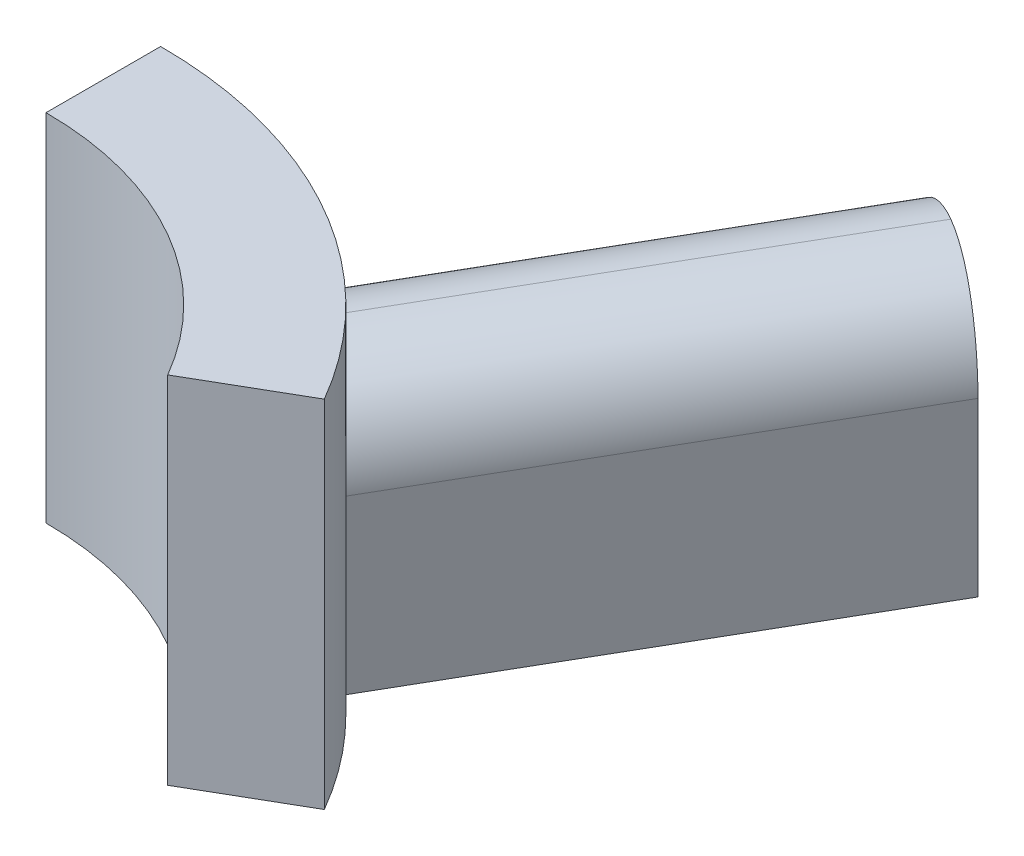
ISO-10303-21;
HEADER;
FILE_DESCRIPTION(('STEP AP214'),'2;1');
FILE_NAME('part.step','',(''),(''),'','','');
FILE_SCHEMA(('AUTOMOTIVE_DESIGN { 1 0 10303 214 1 1 1 1 }'));
ENDSEC;
DATA;
#1=APPLICATION_CONTEXT('core data for automotive mechanical design processes');
#2=APPLICATION_PROTOCOL_DEFINITION('international standard','automotive_design',2000,#1);
#3=PRODUCT_CONTEXT('',#1,'mechanical');
#4=PRODUCT('Part','Part','',(#3));
#5=PRODUCT_RELATED_PRODUCT_CATEGORY('part','',(#4));
#6=PRODUCT_DEFINITION_FORMATION('','',#4);
#7=PRODUCT_DEFINITION_CONTEXT('part definition',#1,'design');
#8=PRODUCT_DEFINITION('design','',#6,#7);
#9=PRODUCT_DEFINITION_SHAPE('','',#8);
#10=(LENGTH_UNIT() NAMED_UNIT(*) SI_UNIT(.MILLI.,.METRE.));
#11=(NAMED_UNIT(*) PLANE_ANGLE_UNIT() SI_UNIT($,.RADIAN.));
#12=(NAMED_UNIT(*) SI_UNIT($,.STERADIAN.) SOLID_ANGLE_UNIT());
#13=UNCERTAINTY_MEASURE_WITH_UNIT(LENGTH_MEASURE(1.E-05),#10,'distance_accuracy_value','');
#14=(GEOMETRIC_REPRESENTATION_CONTEXT(3) GLOBAL_UNCERTAINTY_ASSIGNED_CONTEXT((#13)) GLOBAL_UNIT_ASSIGNED_CONTEXT((#10,
#11,#12)) REPRESENTATION_CONTEXT('',''));
#15=CARTESIAN_POINT('',(0.,0.,0.));
#16=DIRECTION('',(0.,0.,1.));
#17=DIRECTION('',(1.,0.,0.));
#18=AXIS2_PLACEMENT_3D('',#15,#16,#17);
#19=CARTESIAN_POINT('',(0.,15.5,0.));
#20=DIRECTION('',(0.,-1.,0.));
#21=DIRECTION('',(0.,0.,-1.));
#22=AXIS2_PLACEMENT_3D('',#19,#20,#21);
#23=CYLINDRICAL_SURFACE('',#22,14.5);
#24=CARTESIAN_POINT('',(0.,0.,0.));
#25=DIRECTION('',(0.,-1.,0.));
#26=DIRECTION('',(0.,0.,1.));
#27=AXIS2_PLACEMENT_3D('',#24,#25,#26);
#28=CIRCLE('',#27,14.5);
#29=CARTESIAN_POINT('',(0.,0.,-14.5));
#30=VERTEX_POINT('',#29);
#31=CARTESIAN_POINT('',(12.5573683548744,0.,-7.24999999999997));
#32=VERTEX_POINT('',#31);
#33=EDGE_CURVE('E139',#30,#32,#28,.T.);
#34=ORIENTED_EDGE('',*,*,#33,.T.);
#35=DIRECTION('',(0.,-1.,0.));
#36=VECTOR('',#35,1.);
#37=CARTESIAN_POINT('',(12.5573683548744,15.5,-7.24999999999997));
#38=LINE('',#37,#36);
#39=CARTESIAN_POINT('',(12.5573683548744,15.5,-7.24999999999997));
#40=VERTEX_POINT('',#39);
#41=EDGE_CURVE('E164',#40,#32,#38,.T.);
#42=ORIENTED_EDGE('',*,*,#41,.F.);
#43=CARTESIAN_POINT('',(0.,15.5,0.));
#44=DIRECTION('',(0.,-1.,0.));
#45=DIRECTION('',(0.,0.,1.));
#46=AXIS2_PLACEMENT_3D('',#43,#44,#45);
#47=CIRCLE('',#46,14.5);
#48=CARTESIAN_POINT('',(0.,15.5,-14.5));
#49=VERTEX_POINT('',#48);
#50=EDGE_CURVE('E143',#49,#40,#47,.T.);
#51=ORIENTED_EDGE('',*,*,#50,.F.);
#52=DIRECTION('',(0.,-1.,0.));
#53=VECTOR('',#52,1.);
#54=CARTESIAN_POINT('',(0.,15.5,-14.5));
#55=LINE('',#54,#53);
#56=EDGE_CURVE('E152',#49,#30,#55,.T.);
#57=ORIENTED_EDGE('',*,*,#56,.T.);
#58=EDGE_LOOP('',(#34,#42,#51,#57));
#59=FACE_BOUND('',#58,.T.);
#60=ADVANCED_FACE('F38',(#59),#23,.F.);
#61=CARTESIAN_POINT('',(12.5573683548744,15.5,-7.24999999999997));
#62=DIRECTION('',(-0.499999999999998,0.,-0.86602540378444));
#63=DIRECTION('',(-0.86602540378444,0.,0.499999999999998));
#64=AXIS2_PLACEMENT_3D('',#61,#62,#63);
#65=PLANE('',#64);
#66=DIRECTION('',(0.86602540378444,0.,-0.499999999999998));
#67=VECTOR('',#66,1.);
#68=CARTESIAN_POINT('',(12.5573683548744,0.,-7.24999999999997));
#69=LINE('',#68,#67);
#70=CARTESIAN_POINT('',(16.8874953737966,0.,-9.74999999999996));
#71=VERTEX_POINT('',#70);
#72=EDGE_CURVE('E125',#32,#71,#69,.T.);
#73=ORIENTED_EDGE('',*,*,#72,.T.);
#74=DIRECTION('',(0.,-1.,0.));
#75=VECTOR('',#74,1.);
#76=CARTESIAN_POINT('',(16.8874953737966,15.5,-9.74999999999996));
#77=LINE('',#76,#75);
#78=CARTESIAN_POINT('',(16.8874953737966,15.5,-9.74999999999996));
#79=VERTEX_POINT('',#78);
#80=EDGE_CURVE('E161',#79,#71,#77,.T.);
#81=ORIENTED_EDGE('',*,*,#80,.F.);
#82=DIRECTION('',(0.86602540378444,0.,-0.499999999999998));
#83=VECTOR('',#82,1.);
#84=CARTESIAN_POINT('',(12.5573683548744,15.5,-7.24999999999997));
#85=LINE('',#84,#83);
#86=EDGE_CURVE('E146',#40,#79,#85,.T.);
#87=ORIENTED_EDGE('',*,*,#86,.F.);
#88=ORIENTED_EDGE('',*,*,#41,.T.);
#89=EDGE_LOOP('',(#73,#81,#87,#88));
#90=FACE_BOUND('',#89,.T.);
#91=ADVANCED_FACE('F206',(#90),#65,.F.);
#92=CARTESIAN_POINT('',(0.,15.5,0.));
#93=DIRECTION('',(0.,-1.,0.));
#94=DIRECTION('',(0.,0.,-1.));
#95=AXIS2_PLACEMENT_3D('',#92,#93,#94);
#96=CYLINDRICAL_SURFACE('',#95,19.5);
#97=CARTESIAN_POINT('',(0.,0.,0.));
#98=DIRECTION('',(0.,1.,0.));
#99=DIRECTION('',(0.,0.,-1.));
#100=AXIS2_PLACEMENT_3D('',#97,#98,#99);
#101=CIRCLE('',#100,19.5);
#102=CARTESIAN_POINT('',(13.0067689571336,0.,-14.5283846760659));
#103=VERTEX_POINT('',#102);
#104=EDGE_CURVE('E124',#71,#103,#101,.T.);
#105=ORIENTED_EDGE('',*,*,#104,.T.);
#106=DIRECTION('',(0.,-1.,0.));
#107=VECTOR('',#106,1.);
#108=CARTESIAN_POINT('',(13.0067689571336,11.5,-14.5283846760659));
#109=LINE('',#108,#107);
#110=CARTESIAN_POINT('',(13.0067689571336,7.5,-14.5283846760659));
#111=VERTEX_POINT('',#110);
#112=EDGE_CURVE('E137',#111,#103,#109,.T.);
#113=ORIENTED_EDGE('',*,*,#112,.F.);
#114=CARTESIAN_POINT('',(13.0067689571336,7.5,-14.5283846760659));
#115=CARTESIAN_POINT('',(13.0067745263207,7.61124302147211,-14.5283700124707));
#116=CARTESIAN_POINT('',(13.0032363735848,7.72247928579882,-14.5315470320631));
#117=CARTESIAN_POINT('',(12.9891175678691,7.94413215695619,-14.5441737088385));
#118=CARTESIAN_POINT('',(12.9785378153802,8.0545488667674,-14.5536225639688));
#119=CARTESIAN_POINT('',(12.9504035782809,8.27360745579319,-14.5786619030037));
#120=CARTESIAN_POINT('',(12.9328604396675,8.38225192432975,-14.5942423957949));
#121=CARTESIAN_POINT('',(12.8909030600824,8.59714871967826,-14.6313155751818));
#122=CARTESIAN_POINT('',(12.8664887854479,8.70340103476793,-14.6528082907424));
#123=CARTESIAN_POINT('',(12.7830845929439,9.01747765679169,-14.7257694425751));
#124=CARTESIAN_POINT('',(12.7139109852058,9.22079557702581,-14.7857412602684));
#125=CARTESIAN_POINT('',(12.5498038869681,9.60939022750871,-14.9252787631987));
#126=CARTESIAN_POINT('',(12.4548666373388,9.79466431964814,-15.0048473076042));
#127=CARTESIAN_POINT('',(12.2395215627638,10.1447481899075,-15.181030078342));
#128=CARTESIAN_POINT('',(12.1187943608289,10.3092558800996,-15.2778552531358));
#129=CARTESIAN_POINT('',(11.8549045992679,10.6104774308643,-15.4835126972947));
#130=CARTESIAN_POINT('',(11.7117378108328,10.7471860414361,-15.5923472287132));
#131=CARTESIAN_POINT('',(11.404433726395,10.9901351957022,-15.8185205713314));
#132=CARTESIAN_POINT('',(11.2401112380226,11.0960759583554,-15.9359299603715));
#133=CARTESIAN_POINT('',(10.8953592362019,11.2725068851001,-16.1735849386173));
#134=CARTESIAN_POINT('',(10.7149412327732,11.3430221466939,-16.2938284565526));
#135=CARTESIAN_POINT('',(10.4031121306151,11.4296624591288,-16.4938661656015));
#136=CARTESIAN_POINT('',(10.2747580780029,11.4560069800233,-16.574145615023));
#137=CARTESIAN_POINT('',(10.0146004455167,11.4911820250999,-16.7326394329615));
#138=CARTESIAN_POINT('',(9.88280030637617,11.500029389919,-16.8108557156031));
#139=CARTESIAN_POINT('',(9.74999999999961,11.5,-16.8874953737968));
#140=B_SPLINE_CURVE_WITH_KNOTS('',3,(#114,#115,#116,#117,#118,#119,#120,#121,#122,#123,#124,
#125,#126,#127,#128,#129,#130,#131,#132,#133,#134,#135,#136,#137,#138,#139),.UNSPECIFIED.,.F.,
.F.,(4,2,2,2,2,2,2,2,2,2,2,2,4),(0.,0.333615682105476,0.66718870910794,1.00022043568754,
1.33325379386683,1.99879754485732,2.66443845647286,3.33885734324877,4.01340347949084,
4.69431692087422,5.37474728055635,5.8347610693584,6.29433188887586),.UNSPECIFIED.);
#141=CARTESIAN_POINT('',(9.74999999999961,11.5,-16.8874953737968));
#142=VERTEX_POINT('',#141);
#143=EDGE_CURVE('E48',#111,#142,#140,.T.);
#144=ORIENTED_EDGE('',*,*,#143,.T.);
#145=CARTESIAN_POINT('',(9.74999999999962,11.5,-16.8874953737968));
#146=CARTESIAN_POINT('',(9.65364368731658,11.5000120955402,-16.9431372533105));
#147=CARTESIAN_POINT('',(9.55680790616495,11.4953574287586,-16.9979354332376));
#148=CARTESIAN_POINT('',(9.36290835420122,11.4768083431247,-17.1055004149339));
#149=CARTESIAN_POINT('',(9.2658446126663,11.4629150523678,-17.1582674638852));
#150=CARTESIAN_POINT('',(9.0723499753815,11.4260117752553,-17.2613580312628));
#151=CARTESIAN_POINT('',(8.97591831941023,11.4030163021566,-17.3116852971764));
#152=CARTESIAN_POINT('',(8.78429463195907,11.348112701685,-17.409703441215));
#153=CARTESIAN_POINT('',(8.68910260479188,11.3162045433133,-17.4573943101698));
#154=CARTESIAN_POINT('',(8.40644911115283,11.2074269867779,-17.5961778724217));
#155=CARTESIAN_POINT('',(8.22176160288913,11.117475975776,-17.683060269573));
#156=CARTESIAN_POINT('',(7.8659508846285,10.9054483987288,-17.8441899330365));
#157=CARTESIAN_POINT('',(7.69482943037993,10.7833676831906,-17.9184355652925));
#158=CARTESIAN_POINT('',(7.36934959639729,10.5087020704534,-18.0547560548947));
#159=CARTESIAN_POINT('',(7.21522916356286,10.3557527684681,-18.116666063137));
#160=CARTESIAN_POINT('',(6.9313796119343,10.0244542560789,-18.2271567988212));
#161=CARTESIAN_POINT('',(6.80165544898798,9.84609989780674,-18.2757348189273));
#162=CARTESIAN_POINT('',(6.57003062945157,9.46692501166165,-18.3602858968628));
#163=CARTESIAN_POINT('',(6.4684169785501,9.26590027310167,-18.3961299228394));
#164=CARTESIAN_POINT('',(6.29868849146471,8.84848352907437,-18.4549354326921));
#165=CARTESIAN_POINT('',(6.23054940634088,8.63210277791515,-18.4779062436146));
#166=CARTESIAN_POINT('',(6.14673877314093,8.26208588967874,-18.505914807064));
#167=CARTESIAN_POINT('',(6.12121816105916,8.11085913219336,-18.5143524219897));
#168=CARTESIAN_POINT('',(6.0871190890969,7.8064464361338,-18.5255787608175));
#169=CARTESIAN_POINT('',(6.07852477010785,7.65326246697651,-18.5283727725627));
#170=CARTESIAN_POINT('',(6.07856572685798,7.5,-18.5283846760657));
#171=B_SPLINE_CURVE_WITH_KNOTS('',3,(#145,#146,#147,#148,#149,#150,#151,#152,#153,#154,#155,
#156,#157,#158,#159,#160,#161,#162,#163,#164,#165,#166,#167,#168,#169,#170),.UNSPECIFIED.,.F.,
.F.,(4,2,2,2,2,2,2,2,2,2,2,2,4),(0.,0.333690822761368,0.667340907206283,1.00046112221227,
1.33358249584287,1.99931986785164,2.66514326086116,3.33934228099366,4.01367811003857,
4.6946640930046,5.37515604036038,5.83495929024732,6.29433152164226),.UNSPECIFIED.);
#172=CARTESIAN_POINT('',(6.07856572685798,7.5,-18.5283846760657));
#173=VERTEX_POINT('',#172);
#174=EDGE_CURVE('E11',#142,#173,#171,.T.);
#175=ORIENTED_EDGE('',*,*,#174,.T.);
#176=DIRECTION('',(0.,-1.,0.));
#177=VECTOR('',#176,1.);
#178=CARTESIAN_POINT('',(6.07856572685798,11.5,-18.5283846760657));
#179=LINE('',#178,#177);
#180=CARTESIAN_POINT('',(6.07856572685798,0.,-18.5283846760657));
#181=VERTEX_POINT('',#180);
#182=EDGE_CURVE('E103',#173,#181,#179,.T.);
#183=ORIENTED_EDGE('',*,*,#182,.T.);
#184=CARTESIAN_POINT('',(0.,0.,-19.5));
#185=VERTEX_POINT('',#184);
#186=EDGE_CURVE('E108',#181,#185,#101,.T.);
#187=ORIENTED_EDGE('',*,*,#186,.T.);
#188=DIRECTION('',(0.,-1.,0.));
#189=VECTOR('',#188,1.);
#190=CARTESIAN_POINT('',(0.,15.5,-19.5));
#191=LINE('',#190,#189);
#192=CARTESIAN_POINT('',(0.,15.5,-19.5));
#193=VERTEX_POINT('',#192);
#194=EDGE_CURVE('E159',#193,#185,#191,.T.);
#195=ORIENTED_EDGE('',*,*,#194,.F.);
#196=CARTESIAN_POINT('',(0.,15.5,0.));
#197=DIRECTION('',(0.,1.,0.));
#198=DIRECTION('',(0.,0.,-1.));
#199=AXIS2_PLACEMENT_3D('',#196,#197,#198);
#200=CIRCLE('',#199,19.5);
#201=EDGE_CURVE('E148',#79,#193,#200,.T.);
#202=ORIENTED_EDGE('',*,*,#201,.F.);
#203=ORIENTED_EDGE('',*,*,#80,.T.);
#204=EDGE_LOOP('',(#105,#113,#144,#175,#183,#187,#195,#202,#203));
#205=FACE_BOUND('',#204,.T.);
#206=ADVANCED_FACE('F106',(#205),#96,.T.);
#207=CARTESIAN_POINT('',(0.,15.5,-14.5));
#208=DIRECTION('',(1.,0.,0.));
#209=DIRECTION('',(0.,0.,-1.));
#210=AXIS2_PLACEMENT_3D('',#207,#208,#209);
#211=PLANE('',#210);
#212=DIRECTION('',(0.,0.,1.));
#213=VECTOR('',#212,1.);
#214=CARTESIAN_POINT('',(0.,0.,-14.5));
#215=LINE('',#214,#213);
#216=EDGE_CURVE('E123',#185,#30,#215,.T.);
#217=ORIENTED_EDGE('',*,*,#216,.T.);
#218=ORIENTED_EDGE('',*,*,#56,.F.);
#219=DIRECTION('',(0.,0.,1.));
#220=VECTOR('',#219,1.);
#221=CARTESIAN_POINT('',(0.,15.5,-14.5));
#222=LINE('',#221,#220);
#223=EDGE_CURVE('E150',#193,#49,#222,.T.);
#224=ORIENTED_EDGE('',*,*,#223,.F.);
#225=ORIENTED_EDGE('',*,*,#194,.T.);
#226=EDGE_LOOP('',(#217,#218,#224,#225));
#227=FACE_BOUND('',#226,.T.);
#228=ADVANCED_FACE('F196',(#227),#211,.F.);
#229=CARTESIAN_POINT('',(0.,15.5,0.));
#230=DIRECTION('',(0.,1.,0.));
#231=DIRECTION('',(0.,0.,1.));
#232=AXIS2_PLACEMENT_3D('',#229,#230,#231);
#233=PLANE('',#232);
#234=ORIENTED_EDGE('',*,*,#50,.T.);
#235=ORIENTED_EDGE('',*,*,#86,.T.);
#236=ORIENTED_EDGE('',*,*,#201,.T.);
#237=ORIENTED_EDGE('',*,*,#223,.T.);
#238=EDGE_LOOP('',(#234,#235,#236,#237));
#239=FACE_BOUND('',#238,.T.);
#240=ADVANCED_FACE('F193',(#239),#233,.T.);
#241=CARTESIAN_POINT('',(0.,0.,0.));
#242=DIRECTION('',(0.,1.,0.));
#243=DIRECTION('',(0.,0.,1.));
#244=AXIS2_PLACEMENT_3D('',#241,#242,#243);
#245=PLANE('',#244);
#246=ORIENTED_EDGE('',*,*,#33,.F.);
#247=ORIENTED_EDGE('',*,*,#216,.F.);
#248=ORIENTED_EDGE('',*,*,#186,.F.);
#249=DIRECTION('',(0.499999999999995,0.,-0.866025403784442));
#250=VECTOR('',#249,1.);
#251=CARTESIAN_POINT('',(6.07856572685798,0.,-18.5283846760657));
#252=LINE('',#251,#250);
#253=CARTESIAN_POINT('',(16.1843716079902,0.,-36.0321539136153));
#254=VERTEX_POINT('',#253);
#255=EDGE_CURVE('E122',#181,#254,#252,.T.);
#256=ORIENTED_EDGE('',*,*,#255,.T.);
#257=CARTESIAN_POINT('',(1.85181731060524E-12,0.,1.11759559939806E-12));
#258=DIRECTION('',(0.,-1.,0.));
#259=DIRECTION('',(0.,0.,1.));
#260=AXIS2_PLACEMENT_3D('',#257,#258,#259);
#261=CIRCLE('',#260,39.5);
#262=CARTESIAN_POINT('',(23.1125748382659,0.,-32.0321539136158));
#263=VERTEX_POINT('',#262);
#264=EDGE_CURVE('E130',#254,#263,#261,.T.);
#265=ORIENTED_EDGE('',*,*,#264,.T.);
#266=DIRECTION('',(-0.499999999999995,0.,0.866025403784442));
#267=VECTOR('',#266,1.);
#268=CARTESIAN_POINT('',(13.0067689571336,0.,-14.5283846760659));
#269=LINE('',#268,#267);
#270=EDGE_CURVE('E114',#263,#103,#269,.T.);
#271=ORIENTED_EDGE('',*,*,#270,.T.);
#272=ORIENTED_EDGE('',*,*,#104,.F.);
#273=ORIENTED_EDGE('',*,*,#72,.F.);
#274=EDGE_LOOP('',(#246,#247,#248,#256,#265,#271,#272,#273));
#275=FACE_BOUND('',#274,.T.);
#276=ADVANCED_FACE('F120',(#275),#245,.F.);
#277=CARTESIAN_POINT('',(13.0067689571336,11.5,-14.5283846760659));
#278=DIRECTION('',(0.866025403784441,0.,0.499999999999995));
#279=DIRECTION('',(0.499999999999995,0.,-0.866025403784442));
#280=AXIS2_PLACEMENT_3D('',#277,#278,#279);
#281=PLANE('',#280);
#282=DIRECTION('',(0.,-1.,0.));
#283=VECTOR('',#282,1.);
#284=CARTESIAN_POINT('',(23.1125748382659,11.5,-32.0321539136158));
#285=LINE('',#284,#283);
#286=CARTESIAN_POINT('',(23.1125748382659,7.5,-32.0321539136158));
#287=VERTEX_POINT('',#286);
#288=EDGE_CURVE('E140',#287,#263,#285,.T.);
#289=ORIENTED_EDGE('',*,*,#288,.F.);
#290=DIRECTION('',(-0.499999999999995,0.,0.866025403784442));
#291=VECTOR('',#290,1.);
#292=CARTESIAN_POINT('',(13.0067689571336,7.5,-14.5283846760659));
#293=LINE('',#292,#291);
#294=EDGE_CURVE('E167',#287,#111,#293,.T.);
#295=ORIENTED_EDGE('',*,*,#294,.T.);
#296=ORIENTED_EDGE('',*,*,#112,.T.);
#297=ORIENTED_EDGE('',*,*,#270,.F.);
#298=EDGE_LOOP('',(#289,#295,#296,#297));
#299=FACE_BOUND('',#298,.T.);
#300=ADVANCED_FACE('F188',(#299),#281,.T.);
#301=CARTESIAN_POINT('',(1.85181731060524E-12,11.5,1.11759559939806E-12));
#302=DIRECTION('',(0.,-1.,0.));
#303=DIRECTION('',(0.,0.,-1.));
#304=AXIS2_PLACEMENT_3D('',#301,#302,#303);
#305=CYLINDRICAL_SURFACE('',#304,39.5);
#306=CARTESIAN_POINT('',(16.1843716079902,7.5,-36.0321539136153));
#307=CARTESIAN_POINT('',(16.1843596182553,7.61220002393492,-36.0321553794729));
#308=CARTESIAN_POINT('',(16.188700113566,7.72439454671037,-36.0302095999937));
#309=CARTESIAN_POINT('',(16.2059940740696,7.9479751767217,-36.0224363507957));
#310=CARTESIAN_POINT('',(16.2189469620056,8.05936133763329,-36.0166091412347));
#311=CARTESIAN_POINT('',(16.2533570704049,8.28043604555169,-36.001093341293));
#312=CARTESIAN_POINT('',(16.2748060477621,8.39012613126441,-35.9914084936329));
#313=CARTESIAN_POINT('',(16.3260045202391,8.60710649819558,-35.9682131723672));
#314=CARTESIAN_POINT('',(16.3557539476558,8.7143967989803,-35.9547027299653));
#315=CARTESIAN_POINT('',(16.4571503442326,9.03161658094059,-35.9084643334851));
#316=CARTESIAN_POINT('',(16.5409628005208,9.23700550991374,-35.8700216083821));
#317=CARTESIAN_POINT('',(16.738143619376,9.62932671701325,-35.7784331963734));
#318=CARTESIAN_POINT('',(16.851509128466,9.81626077463733,-35.7252889289359));
#319=CARTESIAN_POINT('',(17.1045951941344,10.1672047083445,-35.6048097609999));
#320=CARTESIAN_POINT('',(17.2443986475194,10.331139574894,-35.5374301451676));
#321=CARTESIAN_POINT('',(17.5457407981071,10.6307723478115,-35.3896182731842));
#322=CARTESIAN_POINT('',(17.7072836812781,10.7664648032034,-35.3091835026223));
#323=CARTESIAN_POINT('',(18.0474799819594,11.0060336470533,-35.1365181080989));
#324=CARTESIAN_POINT('',(18.2261731052268,11.1098337477953,-35.0442599370461));
#325=CARTESIAN_POINT('',(18.5948642613463,11.2821457843439,-34.8500260063814));
#326=CARTESIAN_POINT('',(18.7848552714538,11.3506793911627,-34.7480562602318));
#327=CARTESIAN_POINT('',(19.1050446829745,11.4336198985459,-34.5726546354724));
#328=CARTESIAN_POINT('',(19.233731704697,11.4584938794123,-34.5012357740555));
#329=CARTESIAN_POINT('',(19.4917377610119,11.4916836281014,-34.3561386611644));
#330=CARTESIAN_POINT('',(19.6210557411324,11.5000211413385,-34.2824635064208));
#331=CARTESIAN_POINT('',(19.7499999999995,11.5,-34.2080034494856));
#332=B_SPLINE_CURVE_WITH_KNOTS('',3,(#306,#307,#308,#309,#310,#311,#312,#313,#314,#315,#316,
#317,#318,#319,#320,#321,#322,#323,#324,#325,#326,#327,#328,#329,#330,#331),.UNSPECIFIED.,.F.,
.F.,(4,2,2,2,2,2,2,2,2,2,2,2,4),(0.,0.336489453326583,0.672956355282419,1.00909760560232,
1.34523611424883,2.01718080166474,2.68906063388421,3.36308318147086,4.03723569957017,
4.71298848185539,5.38832552145405,5.83524183122018,6.28157005645844),.UNSPECIFIED.);
#333=CARTESIAN_POINT('',(16.1843716079902,7.5,-36.0321539136153));
#334=VERTEX_POINT('',#333);
#335=CARTESIAN_POINT('',(19.7499999999995,11.5,-34.2080034494856));
#336=VERTEX_POINT('',#335);
#337=EDGE_CURVE('E170',#334,#336,#332,.T.);
#338=ORIENTED_EDGE('',*,*,#337,.T.);
#339=CARTESIAN_POINT('',(19.7499999999995,11.5,-34.2080034494856));
#340=CARTESIAN_POINT('',(19.8471716807301,11.5000111127506,-34.1519067000531));
#341=CARTESIAN_POINT('',(19.9440949879872,11.4952791212582,-34.0953907408672));
#342=CARTESIAN_POINT('',(20.1367714412258,11.4764149734499,-33.9819487069737));
#343=CARTESIAN_POINT('',(20.2325246647987,11.4622834439256,-33.9250226598625));
#344=CARTESIAN_POINT('',(20.4221090768098,11.4247243886069,-33.8112361348737));
#345=CARTESIAN_POINT('',(20.5159420322523,11.4013058541661,-33.7543756467688));
#346=CARTESIAN_POINT('',(20.7011123875435,11.3453671495433,-33.6411318070331));
#347=CARTESIAN_POINT('',(20.7924498079507,11.3128470543661,-33.5847484514741));
#348=CARTESIAN_POINT('',(21.0618693437244,11.2019119556282,-33.4169452213012));
#349=CARTESIAN_POINT('',(21.235453181866,11.1101033032138,-33.3068153461875));
#350=CARTESIAN_POINT('',(21.5656088453213,10.8935371538324,-33.0940061065693));
#351=CARTESIAN_POINT('',(21.7221823278236,10.7687828705758,-32.9913260166137));
#352=CARTESIAN_POINT('',(22.0150162157482,10.489359568215,-32.7966475346464));
#353=CARTESIAN_POINT('',(22.1512110132312,10.3345974623755,-32.7046838450716));
#354=CARTESIAN_POINT('',(22.399355191706,9.99972564587191,-32.5352353061764));
#355=CARTESIAN_POINT('',(22.511299872157,9.81961103212676,-32.4577532643164));
#356=CARTESIAN_POINT('',(22.7084629650512,9.43866227902923,-32.3201214250538));
#357=CARTESIAN_POINT('',(22.7936165962648,9.23777945509307,-32.2600136670389));
#358=CARTESIAN_POINT('',(22.9347449190427,8.82136461904591,-32.1598353941185));
#359=CARTESIAN_POINT('',(22.9907375571207,8.60584170941736,-32.1197525559218));
#360=CARTESIAN_POINT('',(23.0584481874777,8.24085189512352,-32.0711563139365));
#361=CARTESIAN_POINT('',(23.0787358274235,8.09370065582016,-32.0565505228232));
#362=CARTESIAN_POINT('',(23.1057963369468,7.79772091539051,-32.0370450174899));
#363=CARTESIAN_POINT('',(23.1125869356836,7.64889487314317,-32.0321325705523));
#364=CARTESIAN_POINT('',(23.1125748382659,7.5,-32.0321539136158));
#365=B_SPLINE_CURVE_WITH_KNOTS('',3,(#339,#340,#341,#342,#343,#344,#345,#346,#347,#348,#349,
#350,#351,#352,#353,#354,#355,#356,#357,#358,#359,#360,#361,#362,#363,#364),.UNSPECIFIED.,.F.,
.F.,(4,2,2,2,2,2,2,2,2,2,2,2,4),(0.,0.336493958102405,0.672965479949521,1.00911203402885,
1.34525581804821,2.01721212420864,2.68910290799939,3.36311229737117,4.03725221721916,
4.71300990930597,5.38835122776354,5.83525434035702,6.28157003038398),.UNSPECIFIED.);
#366=EDGE_CURVE('E177',#336,#287,#365,.T.);
#367=ORIENTED_EDGE('',*,*,#366,.T.);
#368=ORIENTED_EDGE('',*,*,#288,.T.);
#369=ORIENTED_EDGE('',*,*,#264,.F.);
#370=DIRECTION('',(0.,-1.,0.));
#371=VECTOR('',#370,1.);
#372=CARTESIAN_POINT('',(16.1843716079902,11.5,-36.0321539136153));
#373=LINE('',#372,#371);
#374=EDGE_CURVE('E113',#334,#254,#373,.T.);
#375=ORIENTED_EDGE('',*,*,#374,.F.);
#376=EDGE_LOOP('',(#338,#367,#368,#369,#375));
#377=FACE_BOUND('',#376,.T.);
#378=ADVANCED_FACE('F183',(#377),#305,.T.);
#379=CARTESIAN_POINT('',(6.07856572685798,11.5,-18.5283846760657));
#380=DIRECTION('',(-0.866025403784441,0.,-0.499999999999995));
#381=DIRECTION('',(-0.499999999999995,0.,0.866025403784442));
#382=AXIS2_PLACEMENT_3D('',#379,#380,#381);
#383=PLANE('',#382);
#384=ORIENTED_EDGE('',*,*,#182,.F.);
#385=DIRECTION('',(0.499999999999995,0.,-0.866025403784442));
#386=VECTOR('',#385,1.);
#387=CARTESIAN_POINT('',(16.1843716079902,7.5,-36.0321539136153));
#388=LINE('',#387,#386);
#389=EDGE_CURVE('E218',#173,#334,#388,.T.);
#390=ORIENTED_EDGE('',*,*,#389,.T.);
#391=ORIENTED_EDGE('',*,*,#374,.T.);
#392=ORIENTED_EDGE('',*,*,#255,.F.);
#393=EDGE_LOOP('',(#384,#390,#391,#392));
#394=FACE_BOUND('',#393,.T.);
#395=ADVANCED_FACE('F127',(#394),#383,.T.);
#396=CARTESIAN_POINT('',(9.54266734199574,7.5,-16.5283846760658));
#397=DIRECTION('',(-0.499999999999995,0.,0.866025403784442));
#398=DIRECTION('',(0.866025403784441,0.,0.499999999999995));
#399=AXIS2_PLACEMENT_3D('',#396,#397,#398);
#400=CYLINDRICAL_SURFACE('',#399,4.);
#401=DIRECTION('',(0.499999999999995,0.,-0.866025403784442));
#402=VECTOR('',#401,1.);
#403=CARTESIAN_POINT('',(9.54266734199574,11.5,-16.5283846760658));
#404=LINE('',#403,#402);
#405=EDGE_CURVE('E43',#336,#142,#404,.F.);
#406=ORIENTED_EDGE('',*,*,#405,.F.);
#407=ORIENTED_EDGE('',*,*,#337,.F.);
#408=ORIENTED_EDGE('',*,*,#389,.F.);
#409=ORIENTED_EDGE('',*,*,#174,.F.);
#410=EDGE_LOOP('',(#406,#407,#408,#409));
#411=FACE_BOUND('',#410,.T.);
#412=ADVANCED_FACE('F40',(#411),#400,.T.);
#413=CARTESIAN_POINT('',(9.54266734199581,7.5,-16.5283846760659));
#414=DIRECTION('',(0.499999999999995,0.,-0.866025403784442));
#415=DIRECTION('',(-0.866025403784441,0.,-0.499999999999995));
#416=AXIS2_PLACEMENT_3D('',#413,#414,#415);
#417=CYLINDRICAL_SURFACE('',#416,4.);
#418=ORIENTED_EDGE('',*,*,#366,.F.);
#419=ORIENTED_EDGE('',*,*,#405,.T.);
#420=ORIENTED_EDGE('',*,*,#143,.F.);
#421=ORIENTED_EDGE('',*,*,#294,.F.);
#422=EDGE_LOOP('',(#418,#419,#420,#421));
#423=FACE_BOUND('',#422,.T.);
#424=ADVANCED_FACE('F219',(#423),#417,.T.);
#425=CLOSED_SHELL('',(#60,#91,#206,#228,#240,#276,#300,#378,#395,#412,#424));
#426=MANIFOLD_SOLID_BREP('B2',#425);
#427=ADVANCED_BREP_SHAPE_REPRESENTATION('',(#18,#426),#14);
#428=SHAPE_DEFINITION_REPRESENTATION(#9,#427);
ENDSEC;
END-ISO-10303-21;
